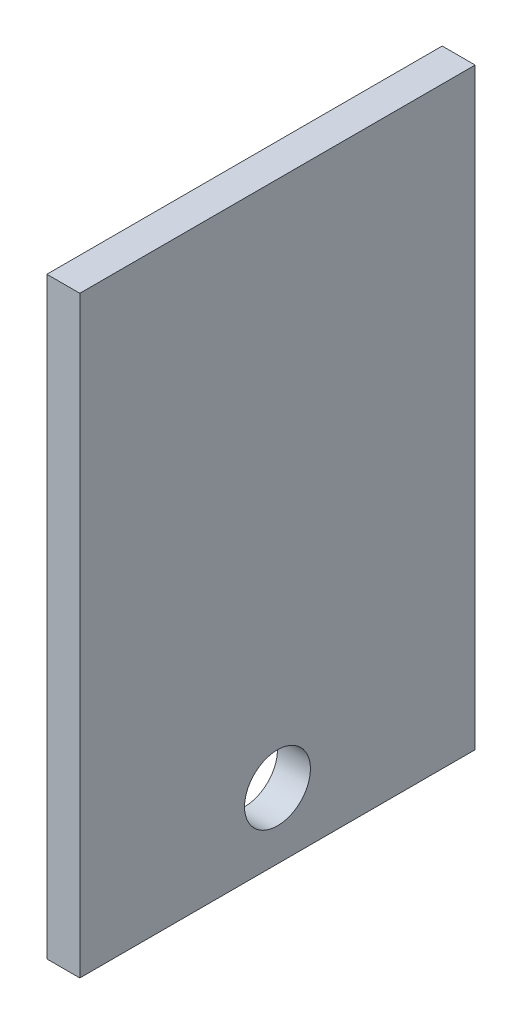
ISO-10303-21;
HEADER;
FILE_DESCRIPTION(('STEP AP214'),'2;1');
FILE_NAME('part.step','',(''),(''),'','','');
FILE_SCHEMA(('AUTOMOTIVE_DESIGN { 1 0 10303 214 1 1 1 1 }'));
ENDSEC;
DATA;
#1=APPLICATION_CONTEXT('core data for automotive mechanical design processes');
#2=APPLICATION_PROTOCOL_DEFINITION('international standard','automotive_design',2000,#1);
#3=PRODUCT_CONTEXT('',#1,'mechanical');
#4=PRODUCT('Part','Part','',(#3));
#5=PRODUCT_RELATED_PRODUCT_CATEGORY('part','',(#4));
#6=PRODUCT_DEFINITION_FORMATION('','',#4);
#7=PRODUCT_DEFINITION_CONTEXT('part definition',#1,'design');
#8=PRODUCT_DEFINITION('design','',#6,#7);
#9=PRODUCT_DEFINITION_SHAPE('','',#8);
#10=(LENGTH_UNIT() NAMED_UNIT(*) SI_UNIT(.MILLI.,.METRE.));
#11=(NAMED_UNIT(*) PLANE_ANGLE_UNIT() SI_UNIT($,.RADIAN.));
#12=(NAMED_UNIT(*) SI_UNIT($,.STERADIAN.) SOLID_ANGLE_UNIT());
#13=UNCERTAINTY_MEASURE_WITH_UNIT(LENGTH_MEASURE(1.E-05),#10,'distance_accuracy_value','');
#14=(GEOMETRIC_REPRESENTATION_CONTEXT(3) GLOBAL_UNCERTAINTY_ASSIGNED_CONTEXT((#13)) GLOBAL_UNIT_ASSIGNED_CONTEXT((#10,
#11,#12)) REPRESENTATION_CONTEXT('',''));
#15=CARTESIAN_POINT('',(0.,0.,0.));
#16=DIRECTION('',(0.,0.,1.));
#17=DIRECTION('',(1.,0.,0.));
#18=AXIS2_PLACEMENT_3D('',#15,#16,#17);
#19=CARTESIAN_POINT('',(25.4,-152.4,-152.4));
#20=DIRECTION('',(0.,0.,1.));
#21=DIRECTION('',(1.,0.,0.));
#22=AXIS2_PLACEMENT_3D('',#19,#20,#21);
#23=PLANE('',#22);
#24=DIRECTION('',(0.,1.,0.));
#25=VECTOR('',#24,1.);
#26=CARTESIAN_POINT('',(0.,-152.4,-152.4));
#27=LINE('',#26,#25);
#28=CARTESIAN_POINT('',(0.,-152.4,-152.4));
#29=VERTEX_POINT('',#28);
#30=CARTESIAN_POINT('',(0.,304.8,-152.4));
#31=VERTEX_POINT('',#30);
#32=EDGE_CURVE('E70',#29,#31,#27,.T.);
#33=ORIENTED_EDGE('',*,*,#32,.T.);
#34=DIRECTION('',(-1.,0.,0.));
#35=VECTOR('',#34,1.);
#36=CARTESIAN_POINT('',(0.,304.8,-152.4));
#37=LINE('',#36,#35);
#38=CARTESIAN_POINT('',(25.4,304.8,-152.4));
#39=VERTEX_POINT('',#38);
#40=EDGE_CURVE('E96',#39,#31,#37,.T.);
#41=ORIENTED_EDGE('',*,*,#40,.F.);
#42=DIRECTION('',(0.,1.,0.));
#43=VECTOR('',#42,1.);
#44=CARTESIAN_POINT('',(25.4,-152.4,-152.4));
#45=LINE('',#44,#43);
#46=CARTESIAN_POINT('',(25.4,-152.4,-152.4));
#47=VERTEX_POINT('',#46);
#48=EDGE_CURVE('E107',#47,#39,#45,.T.);
#49=ORIENTED_EDGE('',*,*,#48,.F.);
#50=DIRECTION('',(-1.,0.,0.));
#51=VECTOR('',#50,1.);
#52=CARTESIAN_POINT('',(25.4,-152.4,-152.4));
#53=LINE('',#52,#51);
#54=EDGE_CURVE('E43',#47,#29,#53,.T.);
#55=ORIENTED_EDGE('',*,*,#54,.T.);
#56=EDGE_LOOP('',(#33,#41,#49,#55));
#57=FACE_BOUND('',#56,.T.);
#58=ADVANCED_FACE('F35',(#57),#23,.F.);
#59=CARTESIAN_POINT('',(25.4,-152.4,152.4));
#60=DIRECTION('',(0.,0.,-1.));
#61=DIRECTION('',(-1.,0.,0.));
#62=AXIS2_PLACEMENT_3D('',#59,#60,#61);
#63=PLANE('',#62);
#64=DIRECTION('',(0.,-1.,0.));
#65=VECTOR('',#64,1.);
#66=CARTESIAN_POINT('',(0.,-152.4,152.4));
#67=LINE('',#66,#65);
#68=CARTESIAN_POINT('',(0.,304.8,152.4));
#69=VERTEX_POINT('',#68);
#70=CARTESIAN_POINT('',(0.,-152.4,152.4));
#71=VERTEX_POINT('',#70);
#72=EDGE_CURVE('E62',#69,#71,#67,.T.);
#73=ORIENTED_EDGE('',*,*,#72,.T.);
#74=DIRECTION('',(-1.,0.,0.));
#75=VECTOR('',#74,1.);
#76=CARTESIAN_POINT('',(25.4,-152.4,152.4));
#77=LINE('',#76,#75);
#78=CARTESIAN_POINT('',(25.4,-152.4,152.4));
#79=VERTEX_POINT('',#78);
#80=EDGE_CURVE('E11',#79,#71,#77,.T.);
#81=ORIENTED_EDGE('',*,*,#80,.F.);
#82=DIRECTION('',(0.,-1.,0.));
#83=VECTOR('',#82,1.);
#84=CARTESIAN_POINT('',(25.4,-152.4,152.4));
#85=LINE('',#84,#83);
#86=CARTESIAN_POINT('',(25.4,304.8,152.4));
#87=VERTEX_POINT('',#86);
#88=EDGE_CURVE('E89',#87,#79,#85,.T.);
#89=ORIENTED_EDGE('',*,*,#88,.F.);
#90=DIRECTION('',(1.,0.,0.));
#91=VECTOR('',#90,1.);
#92=CARTESIAN_POINT('',(0.,304.8,152.4));
#93=LINE('',#92,#91);
#94=EDGE_CURVE('E87',#69,#87,#93,.T.);
#95=ORIENTED_EDGE('',*,*,#94,.F.);
#96=EDGE_LOOP('',(#73,#81,#89,#95));
#97=FACE_BOUND('',#96,.T.);
#98=ADVANCED_FACE('F88',(#97),#63,.F.);
#99=CARTESIAN_POINT('',(25.4,-152.4,152.4));
#100=DIRECTION('',(0.,1.,0.));
#101=DIRECTION('',(0.,0.,1.));
#102=AXIS2_PLACEMENT_3D('',#99,#100,#101);
#103=PLANE('',#102);
#104=DIRECTION('',(0.,0.,-1.));
#105=VECTOR('',#104,1.);
#106=CARTESIAN_POINT('',(0.,-152.4,152.4));
#107=LINE('',#106,#105);
#108=EDGE_CURVE('E84',#71,#29,#107,.T.);
#109=ORIENTED_EDGE('',*,*,#108,.T.);
#110=ORIENTED_EDGE('',*,*,#54,.F.);
#111=DIRECTION('',(0.,0.,-1.));
#112=VECTOR('',#111,1.);
#113=CARTESIAN_POINT('',(25.4,-152.4,152.4));
#114=LINE('',#113,#112);
#115=EDGE_CURVE('E51',#79,#47,#114,.T.);
#116=ORIENTED_EDGE('',*,*,#115,.F.);
#117=ORIENTED_EDGE('',*,*,#80,.T.);
#118=EDGE_LOOP('',(#109,#110,#116,#117));
#119=FACE_BOUND('',#118,.T.);
#120=ADVANCED_FACE('F114',(#119),#103,.F.);
#121=CARTESIAN_POINT('',(25.4,0.,0.));
#122=DIRECTION('',(-1.,0.,0.));
#123=DIRECTION('',(0.,0.,1.));
#124=AXIS2_PLACEMENT_3D('',#121,#122,#123);
#125=PLANE('',#124);
#126=CARTESIAN_POINT('',(25.4,-101.6,0.));
#127=DIRECTION('',(-1.,0.,0.));
#128=DIRECTION('',(0.,0.,1.));
#129=AXIS2_PLACEMENT_3D('',#126,#127,#128);
#130=CIRCLE('',#129,25.4);
#131=CARTESIAN_POINT('',(25.4,-101.6,25.4));
#132=VERTEX_POINT('',#131);
#133=EDGE_CURVE('E104',#132,#132,#130,.F.);
#134=ORIENTED_EDGE('',*,*,#133,.F.);
#135=EDGE_LOOP('',(#134));
#136=FACE_BOUND('',#135,.T.);
#137=ORIENTED_EDGE('',*,*,#48,.T.);
#138=DIRECTION('',(0.,0.,-1.));
#139=VECTOR('',#138,1.);
#140=CARTESIAN_POINT('',(25.4,304.8,-152.4));
#141=LINE('',#140,#139);
#142=EDGE_CURVE('E93',#87,#39,#141,.T.);
#143=ORIENTED_EDGE('',*,*,#142,.F.);
#144=ORIENTED_EDGE('',*,*,#88,.T.);
#145=ORIENTED_EDGE('',*,*,#115,.T.);
#146=EDGE_LOOP('',(#137,#143,#144,#145));
#147=FACE_BOUND('',#146,.T.);
#148=ADVANCED_FACE('F116',(#136,#147),#125,.F.);
#149=CARTESIAN_POINT('',(0.,0.,0.));
#150=DIRECTION('',(-1.,0.,0.));
#151=DIRECTION('',(0.,0.,1.));
#152=AXIS2_PLACEMENT_3D('',#149,#150,#151);
#153=PLANE('',#152);
#154=CARTESIAN_POINT('',(0.,-101.6,0.));
#155=DIRECTION('',(-1.,0.,0.));
#156=DIRECTION('',(0.,0.,1.));
#157=AXIS2_PLACEMENT_3D('',#154,#155,#156);
#158=CIRCLE('',#157,25.4);
#159=CARTESIAN_POINT('',(0.,-101.6,25.4));
#160=VERTEX_POINT('',#159);
#161=EDGE_CURVE('E101',#160,#160,#158,.T.);
#162=ORIENTED_EDGE('',*,*,#161,.F.);
#163=EDGE_LOOP('',(#162));
#164=FACE_BOUND('',#163,.T.);
#165=ORIENTED_EDGE('',*,*,#32,.F.);
#166=ORIENTED_EDGE('',*,*,#108,.F.);
#167=ORIENTED_EDGE('',*,*,#72,.F.);
#168=DIRECTION('',(0.,0.,1.));
#169=VECTOR('',#168,1.);
#170=CARTESIAN_POINT('',(0.,304.8,-152.4));
#171=LINE('',#170,#169);
#172=EDGE_CURVE('E83',#31,#69,#171,.T.);
#173=ORIENTED_EDGE('',*,*,#172,.F.);
#174=EDGE_LOOP('',(#165,#166,#167,#173));
#175=FACE_BOUND('',#174,.T.);
#176=ADVANCED_FACE('F81',(#164,#175),#153,.T.);
#177=CARTESIAN_POINT('',(97.2420489685533,-101.6,0.));
#178=DIRECTION('',(-1.,0.,0.));
#179=DIRECTION('',(0.,0.,1.));
#180=AXIS2_PLACEMENT_3D('',#177,#178,#179);
#181=CYLINDRICAL_SURFACE('',#180,25.4);
#182=ORIENTED_EDGE('',*,*,#133,.T.);
#183=EDGE_LOOP('',(#182));
#184=FACE_BOUND('',#183,.T.);
#185=ORIENTED_EDGE('',*,*,#161,.T.);
#186=EDGE_LOOP('',(#185));
#187=FACE_BOUND('',#186,.T.);
#188=ADVANCED_FACE('F143',(#184,#187),#181,.F.);
#189=CARTESIAN_POINT('',(0.,304.8,0.));
#190=DIRECTION('',(0.,1.,0.));
#191=DIRECTION('',(0.,0.,1.));
#192=AXIS2_PLACEMENT_3D('',#189,#190,#191);
#193=PLANE('',#192);
#194=ORIENTED_EDGE('',*,*,#172,.T.);
#195=ORIENTED_EDGE('',*,*,#94,.T.);
#196=ORIENTED_EDGE('',*,*,#142,.T.);
#197=ORIENTED_EDGE('',*,*,#40,.T.);
#198=EDGE_LOOP('',(#194,#195,#196,#197));
#199=FACE_BOUND('',#198,.T.);
#200=ADVANCED_FACE('F95',(#199),#193,.T.);
#201=CLOSED_SHELL('',(#58,#98,#120,#148,#176,#188,#200));
#202=MANIFOLD_SOLID_BREP('B2',#201);
#203=ADVANCED_BREP_SHAPE_REPRESENTATION('',(#18,#202),#14);
#204=SHAPE_DEFINITION_REPRESENTATION(#9,#203);
ENDSEC;
END-ISO-10303-21;
